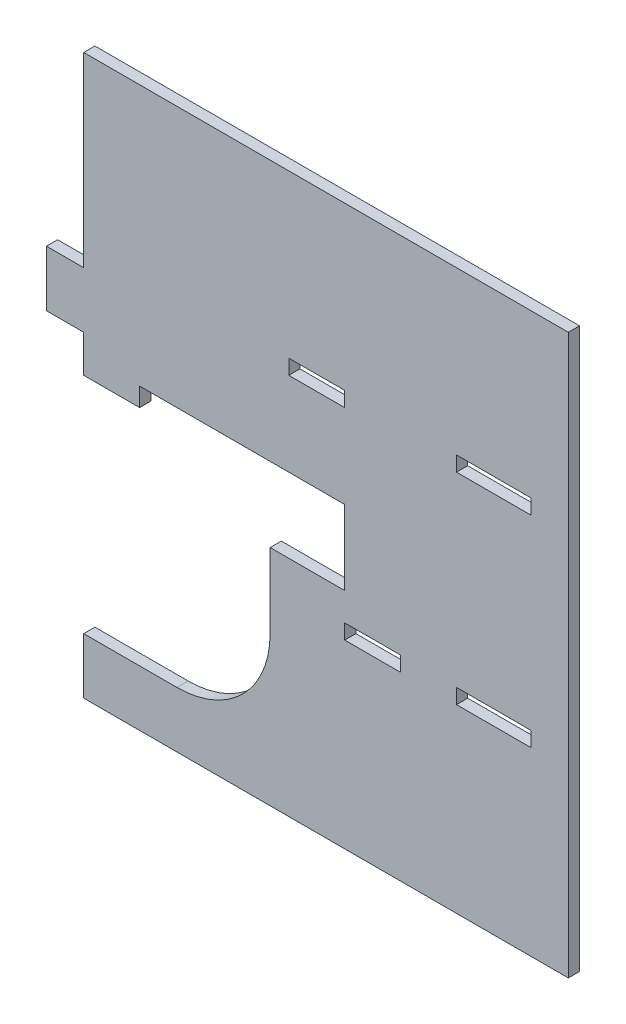
ISO-10303-21;
HEADER;
FILE_DESCRIPTION(('STEP AP214'),'2;1');
FILE_NAME('part.step','',(''),(''),'','','');
FILE_SCHEMA(('AUTOMOTIVE_DESIGN { 1 0 10303 214 1 1 1 1 }'));
ENDSEC;
DATA;
#1=APPLICATION_CONTEXT('core data for automotive mechanical design processes');
#2=APPLICATION_PROTOCOL_DEFINITION('international standard','automotive_design',2000,#1);
#3=PRODUCT_CONTEXT('',#1,'mechanical');
#4=PRODUCT('Part','Part','',(#3));
#5=PRODUCT_RELATED_PRODUCT_CATEGORY('part','',(#4));
#6=PRODUCT_DEFINITION_FORMATION('','',#4);
#7=PRODUCT_DEFINITION_CONTEXT('part definition',#1,'design');
#8=PRODUCT_DEFINITION('design','',#6,#7);
#9=PRODUCT_DEFINITION_SHAPE('','',#8);
#10=(LENGTH_UNIT() NAMED_UNIT(*) SI_UNIT(.MILLI.,.METRE.));
#11=(NAMED_UNIT(*) PLANE_ANGLE_UNIT() SI_UNIT($,.RADIAN.));
#12=(NAMED_UNIT(*) SI_UNIT($,.STERADIAN.) SOLID_ANGLE_UNIT());
#13=UNCERTAINTY_MEASURE_WITH_UNIT(LENGTH_MEASURE(1.E-05),#10,'distance_accuracy_value','');
#14=(GEOMETRIC_REPRESENTATION_CONTEXT(3) GLOBAL_UNCERTAINTY_ASSIGNED_CONTEXT((#13)) GLOBAL_UNIT_ASSIGNED_CONTEXT((#10,
#11,#12)) REPRESENTATION_CONTEXT('',''));
#15=CARTESIAN_POINT('',(0.,0.,0.));
#16=DIRECTION('',(0.,0.,1.));
#17=DIRECTION('',(1.,0.,0.));
#18=AXIS2_PLACEMENT_3D('',#15,#16,#17);
#19=CARTESIAN_POINT('',(3.,0.,0.15));
#20=DIRECTION('',(-1.,0.,0.));
#21=DIRECTION('',(0.,0.,1.));
#22=AXIS2_PLACEMENT_3D('',#19,#20,#21);
#23=PLANE('',#22);
#24=DIRECTION('',(0.,1.,0.));
#25=VECTOR('',#24,1.);
#26=CARTESIAN_POINT('',(3.,0.,-0.15));
#27=LINE('',#26,#25);
#28=CARTESIAN_POINT('',(3.,0.,-0.15));
#29=VERTEX_POINT('',#28);
#30=CARTESIAN_POINT('',(3.,15.,-0.15));
#31=VERTEX_POINT('',#30);
#32=EDGE_CURVE('E404',#29,#31,#27,.T.);
#33=ORIENTED_EDGE('',*,*,#32,.T.);
#34=DIRECTION('',(0.,0.,-1.));
#35=VECTOR('',#34,1.);
#36=CARTESIAN_POINT('',(3.,15.,0.15));
#37=LINE('',#36,#35);
#38=CARTESIAN_POINT('',(3.,15.,0.15));
#39=VERTEX_POINT('',#38);
#40=EDGE_CURVE('E552',#39,#31,#37,.T.);
#41=ORIENTED_EDGE('',*,*,#40,.F.);
#42=DIRECTION('',(0.,1.,0.));
#43=VECTOR('',#42,1.);
#44=CARTESIAN_POINT('',(3.,0.,0.15));
#45=LINE('',#44,#43);
#46=CARTESIAN_POINT('',(3.,0.,0.15));
#47=VERTEX_POINT('',#46);
#48=EDGE_CURVE('E415',#47,#39,#45,.T.);
#49=ORIENTED_EDGE('',*,*,#48,.F.);
#50=DIRECTION('',(0.,0.,-1.));
#51=VECTOR('',#50,1.);
#52=CARTESIAN_POINT('',(3.,0.,0.15));
#53=LINE('',#52,#51);
#54=EDGE_CURVE('E555',#47,#29,#53,.T.);
#55=ORIENTED_EDGE('',*,*,#54,.T.);
#56=EDGE_LOOP('',(#33,#41,#49,#55));
#57=FACE_BOUND('',#56,.T.);
#58=ADVANCED_FACE('F41',(#57),#23,.F.);
#59=CARTESIAN_POINT('',(-10.,15.,0.15));
#60=DIRECTION('',(0.,-1.,0.));
#61=DIRECTION('',(1.,0.,0.));
#62=AXIS2_PLACEMENT_3D('',#59,#60,#61);
#63=PLANE('',#62);
#64=DIRECTION('',(-1.,0.,0.));
#65=VECTOR('',#64,1.);
#66=CARTESIAN_POINT('',(-10.,15.,-0.15));
#67=LINE('',#66,#65);
#68=CARTESIAN_POINT('',(-10.,15.,-0.15));
#69=VERTEX_POINT('',#68);
#70=EDGE_CURVE('E462',#31,#69,#67,.T.);
#71=ORIENTED_EDGE('',*,*,#70,.T.);
#72=DIRECTION('',(0.,0.,-1.));
#73=VECTOR('',#72,1.);
#74=CARTESIAN_POINT('',(-10.,15.,0.15));
#75=LINE('',#74,#73);
#76=CARTESIAN_POINT('',(-10.,15.,0.15));
#77=VERTEX_POINT('',#76);
#78=EDGE_CURVE('E548',#77,#69,#75,.T.);
#79=ORIENTED_EDGE('',*,*,#78,.F.);
#80=DIRECTION('',(-1.,0.,0.));
#81=VECTOR('',#80,1.);
#82=CARTESIAN_POINT('',(3.,15.,0.15));
#83=LINE('',#82,#81);
#84=EDGE_CURVE('E418',#39,#77,#83,.T.);
#85=ORIENTED_EDGE('',*,*,#84,.F.);
#86=ORIENTED_EDGE('',*,*,#40,.T.);
#87=EDGE_LOOP('',(#71,#79,#85,#86));
#88=FACE_BOUND('',#87,.T.);
#89=ADVANCED_FACE('F595',(#88),#63,.F.);
#90=CARTESIAN_POINT('',(-10.,9.99999999999999,0.15));
#91=DIRECTION('',(1.,0.,0.));
#92=DIRECTION('',(0.,0.,-1.));
#93=AXIS2_PLACEMENT_3D('',#90,#91,#92);
#94=PLANE('',#93);
#95=DIRECTION('',(0.,-1.,0.));
#96=VECTOR('',#95,1.);
#97=CARTESIAN_POINT('',(-10.,9.99999999999999,-0.15));
#98=LINE('',#97,#96);
#99=CARTESIAN_POINT('',(-10.,9.99999999999999,-0.15));
#100=VERTEX_POINT('',#99);
#101=EDGE_CURVE('E465',#69,#100,#98,.T.);
#102=ORIENTED_EDGE('',*,*,#101,.T.);
#103=DIRECTION('',(0.,0.,-1.));
#104=VECTOR('',#103,1.);
#105=CARTESIAN_POINT('',(-10.,9.99999999999999,0.15));
#106=LINE('',#105,#104);
#107=CARTESIAN_POINT('',(-10.,9.99999999999999,0.15));
#108=VERTEX_POINT('',#107);
#109=EDGE_CURVE('E544',#108,#100,#106,.T.);
#110=ORIENTED_EDGE('',*,*,#109,.F.);
#111=DIRECTION('',(0.,-1.,0.));
#112=VECTOR('',#111,1.);
#113=CARTESIAN_POINT('',(-10.,9.99999999999999,0.15));
#114=LINE('',#113,#112);
#115=EDGE_CURVE('E421',#77,#108,#114,.T.);
#116=ORIENTED_EDGE('',*,*,#115,.F.);
#117=ORIENTED_EDGE('',*,*,#78,.T.);
#118=EDGE_LOOP('',(#102,#110,#116,#117));
#119=FACE_BOUND('',#118,.T.);
#120=ADVANCED_FACE('F601',(#119),#94,.F.);
#121=CARTESIAN_POINT('',(-11.,10.,0.15));
#122=DIRECTION('',(0.,-1.,0.));
#123=DIRECTION('',(1.,0.,0.));
#124=AXIS2_PLACEMENT_3D('',#121,#122,#123);
#125=PLANE('',#124);
#126=DIRECTION('',(-1.,0.,0.));
#127=VECTOR('',#126,1.);
#128=CARTESIAN_POINT('',(-11.,10.,-0.15));
#129=LINE('',#128,#127);
#130=CARTESIAN_POINT('',(-11.,10.,-0.15));
#131=VERTEX_POINT('',#130);
#132=EDGE_CURVE('E468',#100,#131,#129,.T.);
#133=ORIENTED_EDGE('',*,*,#132,.T.);
#134=DIRECTION('',(0.,0.,-1.));
#135=VECTOR('',#134,1.);
#136=CARTESIAN_POINT('',(-11.,10.,0.15));
#137=LINE('',#136,#135);
#138=CARTESIAN_POINT('',(-11.,10.,0.15));
#139=VERTEX_POINT('',#138);
#140=EDGE_CURVE('E540',#139,#131,#137,.T.);
#141=ORIENTED_EDGE('',*,*,#140,.F.);
#142=DIRECTION('',(-1.,0.,0.));
#143=VECTOR('',#142,1.);
#144=CARTESIAN_POINT('',(-11.,10.,0.15));
#145=LINE('',#144,#143);
#146=EDGE_CURVE('E424',#108,#139,#145,.T.);
#147=ORIENTED_EDGE('',*,*,#146,.F.);
#148=ORIENTED_EDGE('',*,*,#109,.T.);
#149=EDGE_LOOP('',(#133,#141,#147,#148));
#150=FACE_BOUND('',#149,.T.);
#151=ADVANCED_FACE('F605',(#150),#125,.F.);
#152=CARTESIAN_POINT('',(-11.,8.5,0.15));
#153=DIRECTION('',(1.,0.,0.));
#154=DIRECTION('',(0.,0.,-1.));
#155=AXIS2_PLACEMENT_3D('',#152,#153,#154);
#156=PLANE('',#155);
#157=DIRECTION('',(0.,-1.,0.));
#158=VECTOR('',#157,1.);
#159=CARTESIAN_POINT('',(-11.,8.5,-0.15));
#160=LINE('',#159,#158);
#161=CARTESIAN_POINT('',(-11.,8.5,-0.15));
#162=VERTEX_POINT('',#161);
#163=EDGE_CURVE('E471',#131,#162,#160,.T.);
#164=ORIENTED_EDGE('',*,*,#163,.T.);
#165=DIRECTION('',(0.,0.,-1.));
#166=VECTOR('',#165,1.);
#167=CARTESIAN_POINT('',(-11.,8.5,0.15));
#168=LINE('',#167,#166);
#169=CARTESIAN_POINT('',(-11.,8.5,0.15));
#170=VERTEX_POINT('',#169);
#171=EDGE_CURVE('E536',#170,#162,#168,.T.);
#172=ORIENTED_EDGE('',*,*,#171,.F.);
#173=DIRECTION('',(0.,-1.,0.));
#174=VECTOR('',#173,1.);
#175=CARTESIAN_POINT('',(-11.,8.5,0.15));
#176=LINE('',#175,#174);
#177=EDGE_CURVE('E427',#139,#170,#176,.T.);
#178=ORIENTED_EDGE('',*,*,#177,.F.);
#179=ORIENTED_EDGE('',*,*,#140,.T.);
#180=EDGE_LOOP('',(#164,#172,#178,#179));
#181=FACE_BOUND('',#180,.T.);
#182=ADVANCED_FACE('F610',(#181),#156,.F.);
#183=CARTESIAN_POINT('',(-10.,8.5,0.15));
#184=DIRECTION('',(0.,1.,0.));
#185=DIRECTION('',(0.,0.,1.));
#186=AXIS2_PLACEMENT_3D('',#183,#184,#185);
#187=PLANE('',#186);
#188=DIRECTION('',(1.,0.,0.));
#189=VECTOR('',#188,1.);
#190=CARTESIAN_POINT('',(-10.,8.5,-0.15));
#191=LINE('',#190,#189);
#192=CARTESIAN_POINT('',(-10.,8.5,-0.15));
#193=VERTEX_POINT('',#192);
#194=EDGE_CURVE('E474',#162,#193,#191,.T.);
#195=ORIENTED_EDGE('',*,*,#194,.T.);
#196=DIRECTION('',(0.,0.,-1.));
#197=VECTOR('',#196,1.);
#198=CARTESIAN_POINT('',(-10.,8.5,0.15));
#199=LINE('',#198,#197);
#200=CARTESIAN_POINT('',(-10.,8.5,0.15));
#201=VERTEX_POINT('',#200);
#202=EDGE_CURVE('E532',#201,#193,#199,.T.);
#203=ORIENTED_EDGE('',*,*,#202,.F.);
#204=DIRECTION('',(1.,0.,0.));
#205=VECTOR('',#204,1.);
#206=CARTESIAN_POINT('',(-10.,8.5,0.15));
#207=LINE('',#206,#205);
#208=EDGE_CURVE('E430',#170,#201,#207,.T.);
#209=ORIENTED_EDGE('',*,*,#208,.F.);
#210=ORIENTED_EDGE('',*,*,#171,.T.);
#211=EDGE_LOOP('',(#195,#203,#209,#210));
#212=FACE_BOUND('',#211,.T.);
#213=ADVANCED_FACE('F616',(#212),#187,.F.);
#214=CARTESIAN_POINT('',(-10.,7.5,0.15));
#215=DIRECTION('',(1.,0.,0.));
#216=DIRECTION('',(0.,0.,-1.));
#217=AXIS2_PLACEMENT_3D('',#214,#215,#216);
#218=PLANE('',#217);
#219=DIRECTION('',(0.,-1.,0.));
#220=VECTOR('',#219,1.);
#221=CARTESIAN_POINT('',(-10.,7.5,-0.15));
#222=LINE('',#221,#220);
#223=CARTESIAN_POINT('',(-10.,7.5,-0.15));
#224=VERTEX_POINT('',#223);
#225=EDGE_CURVE('E477',#193,#224,#222,.T.);
#226=ORIENTED_EDGE('',*,*,#225,.T.);
#227=DIRECTION('',(0.,0.,-1.));
#228=VECTOR('',#227,1.);
#229=CARTESIAN_POINT('',(-10.,7.5,0.15));
#230=LINE('',#229,#228);
#231=CARTESIAN_POINT('',(-10.,7.5,0.15));
#232=VERTEX_POINT('',#231);
#233=EDGE_CURVE('E528',#232,#224,#230,.T.);
#234=ORIENTED_EDGE('',*,*,#233,.F.);
#235=DIRECTION('',(0.,-1.,0.));
#236=VECTOR('',#235,1.);
#237=CARTESIAN_POINT('',(-10.,7.5,0.15));
#238=LINE('',#237,#236);
#239=EDGE_CURVE('E433',#201,#232,#238,.T.);
#240=ORIENTED_EDGE('',*,*,#239,.F.);
#241=ORIENTED_EDGE('',*,*,#202,.T.);
#242=EDGE_LOOP('',(#226,#234,#240,#241));
#243=FACE_BOUND('',#242,.T.);
#244=ADVANCED_FACE('F620',(#243),#218,.F.);
#245=CARTESIAN_POINT('',(-8.5,7.5,0.15));
#246=DIRECTION('',(0.,1.,0.));
#247=DIRECTION('',(0.,0.,1.));
#248=AXIS2_PLACEMENT_3D('',#245,#246,#247);
#249=PLANE('',#248);
#250=DIRECTION('',(1.,0.,0.));
#251=VECTOR('',#250,1.);
#252=CARTESIAN_POINT('',(-8.5,7.5,-0.15));
#253=LINE('',#252,#251);
#254=CARTESIAN_POINT('',(-8.5,7.5,-0.15));
#255=VERTEX_POINT('',#254);
#256=EDGE_CURVE('E480',#224,#255,#253,.T.);
#257=ORIENTED_EDGE('',*,*,#256,.T.);
#258=DIRECTION('',(0.,0.,-1.));
#259=VECTOR('',#258,1.);
#260=CARTESIAN_POINT('',(-8.5,7.5,0.15));
#261=LINE('',#260,#259);
#262=CARTESIAN_POINT('',(-8.5,7.5,0.15));
#263=VERTEX_POINT('',#262);
#264=EDGE_CURVE('E524',#263,#255,#261,.T.);
#265=ORIENTED_EDGE('',*,*,#264,.F.);
#266=DIRECTION('',(1.,0.,0.));
#267=VECTOR('',#266,1.);
#268=CARTESIAN_POINT('',(-8.5,7.5,0.15));
#269=LINE('',#268,#267);
#270=EDGE_CURVE('E436',#232,#263,#269,.T.);
#271=ORIENTED_EDGE('',*,*,#270,.F.);
#272=ORIENTED_EDGE('',*,*,#233,.T.);
#273=EDGE_LOOP('',(#257,#265,#271,#272));
#274=FACE_BOUND('',#273,.T.);
#275=ADVANCED_FACE('F625',(#274),#249,.F.);
#276=CARTESIAN_POINT('',(-8.5,8.,0.15));
#277=DIRECTION('',(-1.,0.,0.));
#278=DIRECTION('',(0.,0.,1.));
#279=AXIS2_PLACEMENT_3D('',#276,#277,#278);
#280=PLANE('',#279);
#281=DIRECTION('',(0.,1.,0.));
#282=VECTOR('',#281,1.);
#283=CARTESIAN_POINT('',(-8.5,8.,-0.15));
#284=LINE('',#283,#282);
#285=CARTESIAN_POINT('',(-8.5,8.,-0.15));
#286=VERTEX_POINT('',#285);
#287=EDGE_CURVE('E483',#255,#286,#284,.T.);
#288=ORIENTED_EDGE('',*,*,#287,.T.);
#289=DIRECTION('',(0.,0.,-1.));
#290=VECTOR('',#289,1.);
#291=CARTESIAN_POINT('',(-8.5,8.,0.15));
#292=LINE('',#291,#290);
#293=CARTESIAN_POINT('',(-8.5,8.,0.15));
#294=VERTEX_POINT('',#293);
#295=EDGE_CURVE('E520',#294,#286,#292,.T.);
#296=ORIENTED_EDGE('',*,*,#295,.F.);
#297=DIRECTION('',(0.,1.,0.));
#298=VECTOR('',#297,1.);
#299=CARTESIAN_POINT('',(-8.5,8.,0.15));
#300=LINE('',#299,#298);
#301=EDGE_CURVE('E439',#263,#294,#300,.T.);
#302=ORIENTED_EDGE('',*,*,#301,.F.);
#303=ORIENTED_EDGE('',*,*,#264,.T.);
#304=EDGE_LOOP('',(#288,#296,#302,#303));
#305=FACE_BOUND('',#304,.T.);
#306=ADVANCED_FACE('F631',(#305),#280,.F.);
#307=CARTESIAN_POINT('',(-8.5,8.,0.15));
#308=DIRECTION('',(0.,1.,0.));
#309=DIRECTION('',(-1.,0.,0.));
#310=AXIS2_PLACEMENT_3D('',#307,#308,#309);
#311=PLANE('',#310);
#312=DIRECTION('',(1.,0.,0.));
#313=VECTOR('',#312,1.);
#314=CARTESIAN_POINT('',(-8.5,8.,-0.15));
#315=LINE('',#314,#313);
#316=CARTESIAN_POINT('',(-3.,8.,-0.15));
#317=VERTEX_POINT('',#316);
#318=EDGE_CURVE('E486',#286,#317,#315,.T.);
#319=ORIENTED_EDGE('',*,*,#318,.T.);
#320=DIRECTION('',(0.,0.,-1.));
#321=VECTOR('',#320,1.);
#322=CARTESIAN_POINT('',(-3.,8.,0.15));
#323=LINE('',#322,#321);
#324=CARTESIAN_POINT('',(-3.,8.,0.15));
#325=VERTEX_POINT('',#324);
#326=EDGE_CURVE('E517',#325,#317,#323,.T.);
#327=ORIENTED_EDGE('',*,*,#326,.F.);
#328=DIRECTION('',(1.,0.,0.));
#329=VECTOR('',#328,1.);
#330=CARTESIAN_POINT('',(-8.5,8.,0.15));
#331=LINE('',#330,#329);
#332=EDGE_CURVE('E442',#294,#325,#331,.T.);
#333=ORIENTED_EDGE('',*,*,#332,.F.);
#334=ORIENTED_EDGE('',*,*,#295,.T.);
#335=EDGE_LOOP('',(#319,#327,#333,#334));
#336=FACE_BOUND('',#335,.T.);
#337=ADVANCED_FACE('F635',(#336),#311,.F.);
#338=CARTESIAN_POINT('',(-3.,8.,0.15));
#339=DIRECTION('',(1.,0.,0.));
#340=DIRECTION('',(0.,0.,-1.));
#341=AXIS2_PLACEMENT_3D('',#338,#339,#340);
#342=PLANE('',#341);
#343=DIRECTION('',(0.,-1.,0.));
#344=VECTOR('',#343,1.);
#345=CARTESIAN_POINT('',(-3.,8.,-0.15));
#346=LINE('',#345,#344);
#347=CARTESIAN_POINT('',(-3.,6.,-0.15));
#348=VERTEX_POINT('',#347);
#349=EDGE_CURVE('E489',#317,#348,#346,.T.);
#350=ORIENTED_EDGE('',*,*,#349,.T.);
#351=DIRECTION('',(0.,0.,-1.));
#352=VECTOR('',#351,1.);
#353=CARTESIAN_POINT('',(-3.,6.,0.15));
#354=LINE('',#353,#352);
#355=CARTESIAN_POINT('',(-3.,6.,0.15));
#356=VERTEX_POINT('',#355);
#357=EDGE_CURVE('E514',#356,#348,#354,.T.);
#358=ORIENTED_EDGE('',*,*,#357,.F.);
#359=DIRECTION('',(0.,-1.,0.));
#360=VECTOR('',#359,1.);
#361=CARTESIAN_POINT('',(-3.,8.,0.15));
#362=LINE('',#361,#360);
#363=EDGE_CURVE('E445',#325,#356,#362,.T.);
#364=ORIENTED_EDGE('',*,*,#363,.F.);
#365=ORIENTED_EDGE('',*,*,#326,.T.);
#366=EDGE_LOOP('',(#350,#358,#364,#365));
#367=FACE_BOUND('',#366,.T.);
#368=ADVANCED_FACE('F640',(#367),#342,.F.);
#369=CARTESIAN_POINT('',(-5.,6.,0.15));
#370=DIRECTION('',(0.,-1.,0.));
#371=DIRECTION('',(1.,0.,0.));
#372=AXIS2_PLACEMENT_3D('',#369,#370,#371);
#373=PLANE('',#372);
#374=DIRECTION('',(-1.,0.,0.));
#375=VECTOR('',#374,1.);
#376=CARTESIAN_POINT('',(-5.,6.,-0.15));
#377=LINE('',#376,#375);
#378=CARTESIAN_POINT('',(-5.,6.,-0.15));
#379=VERTEX_POINT('',#378);
#380=EDGE_CURVE('E491',#348,#379,#377,.T.);
#381=ORIENTED_EDGE('',*,*,#380,.T.);
#382=DIRECTION('',(0.,0.,-1.));
#383=VECTOR('',#382,1.);
#384=CARTESIAN_POINT('',(-5.,6.,0.15));
#385=LINE('',#384,#383);
#386=CARTESIAN_POINT('',(-5.,6.,0.15));
#387=VERTEX_POINT('',#386);
#388=EDGE_CURVE('E511',#387,#379,#385,.T.);
#389=ORIENTED_EDGE('',*,*,#388,.F.);
#390=DIRECTION('',(-1.,0.,0.));
#391=VECTOR('',#390,1.);
#392=CARTESIAN_POINT('',(-5.,6.,0.15));
#393=LINE('',#392,#391);
#394=EDGE_CURVE('E447',#356,#387,#393,.T.);
#395=ORIENTED_EDGE('',*,*,#394,.F.);
#396=ORIENTED_EDGE('',*,*,#357,.T.);
#397=EDGE_LOOP('',(#381,#389,#395,#396));
#398=FACE_BOUND('',#397,.T.);
#399=ADVANCED_FACE('F643',(#398),#373,.F.);
#400=CARTESIAN_POINT('',(-5.,1.5,0.15));
#401=DIRECTION('',(1.,0.,0.));
#402=DIRECTION('',(0.,0.,-1.));
#403=AXIS2_PLACEMENT_3D('',#400,#401,#402);
#404=PLANE('',#403);
#405=DIRECTION('',(0.,-1.,0.));
#406=VECTOR('',#405,1.);
#407=CARTESIAN_POINT('',(-5.,1.5,-0.15));
#408=LINE('',#407,#406);
#409=CARTESIAN_POINT('',(-5.,4.,-0.15));
#410=VERTEX_POINT('',#409);
#411=EDGE_CURVE('E493',#379,#410,#408,.T.);
#412=ORIENTED_EDGE('',*,*,#411,.T.);
#413=DIRECTION('',(0.,0.,-1.));
#414=VECTOR('',#413,1.);
#415=CARTESIAN_POINT('',(-5.,4.,0.15));
#416=LINE('',#415,#414);
#417=CARTESIAN_POINT('',(-5.,4.,0.15));
#418=VERTEX_POINT('',#417);
#419=EDGE_CURVE('E561',#410,#418,#416,.F.);
#420=ORIENTED_EDGE('',*,*,#419,.T.);
#421=DIRECTION('',(0.,-1.,0.));
#422=VECTOR('',#421,1.);
#423=CARTESIAN_POINT('',(-5.,1.5,0.15));
#424=LINE('',#423,#422);
#425=EDGE_CURVE('E449',#387,#418,#424,.T.);
#426=ORIENTED_EDGE('',*,*,#425,.F.);
#427=ORIENTED_EDGE('',*,*,#388,.T.);
#428=EDGE_LOOP('',(#412,#420,#426,#427));
#429=FACE_BOUND('',#428,.T.);
#430=ADVANCED_FACE('F572',(#429),#404,.F.);
#431=CARTESIAN_POINT('',(-5.,1.5,0.15));
#432=DIRECTION('',(0.,-1.,0.));
#433=DIRECTION('',(1.,0.,0.));
#434=AXIS2_PLACEMENT_3D('',#431,#432,#433);
#435=PLANE('',#434);
#436=DIRECTION('',(-1.,0.,0.));
#437=VECTOR('',#436,1.);
#438=CARTESIAN_POINT('',(-5.,1.5,0.15));
#439=LINE('',#438,#437);
#440=CARTESIAN_POINT('',(-7.5,1.5,0.15));
#441=VERTEX_POINT('',#440);
#442=CARTESIAN_POINT('',(-10.,1.5,0.15));
#443=VERTEX_POINT('',#442);
#444=EDGE_CURVE('E452',#441,#443,#439,.T.);
#445=ORIENTED_EDGE('',*,*,#444,.F.);
#446=DIRECTION('',(0.,0.,-1.));
#447=VECTOR('',#446,1.);
#448=CARTESIAN_POINT('',(-7.5,1.5,-0.15));
#449=LINE('',#448,#447);
#450=CARTESIAN_POINT('',(-7.5,1.5,-0.15));
#451=VERTEX_POINT('',#450);
#452=EDGE_CURVE('E558',#441,#451,#449,.T.);
#453=ORIENTED_EDGE('',*,*,#452,.T.);
#454=DIRECTION('',(-1.,0.,0.));
#455=VECTOR('',#454,1.);
#456=CARTESIAN_POINT('',(-5.,1.5,-0.15));
#457=LINE('',#456,#455);
#458=CARTESIAN_POINT('',(-10.,1.5,-0.15));
#459=VERTEX_POINT('',#458);
#460=EDGE_CURVE('E496',#451,#459,#457,.T.);
#461=ORIENTED_EDGE('',*,*,#460,.T.);
#462=DIRECTION('',(0.,0.,-1.));
#463=VECTOR('',#462,1.);
#464=CARTESIAN_POINT('',(-10.,1.5,0.15));
#465=LINE('',#464,#463);
#466=EDGE_CURVE('E507',#443,#459,#465,.T.);
#467=ORIENTED_EDGE('',*,*,#466,.F.);
#468=EDGE_LOOP('',(#445,#453,#461,#467));
#469=FACE_BOUND('',#468,.T.);
#470=ADVANCED_FACE('F581',(#469),#435,.F.);
#471=CARTESIAN_POINT('',(-10.,1.5,0.15));
#472=DIRECTION('',(1.,0.,0.));
#473=DIRECTION('',(0.,0.,-1.));
#474=AXIS2_PLACEMENT_3D('',#471,#472,#473);
#475=PLANE('',#474);
#476=DIRECTION('',(0.,-1.,0.));
#477=VECTOR('',#476,1.);
#478=CARTESIAN_POINT('',(-10.,1.5,-0.15));
#479=LINE('',#478,#477);
#480=CARTESIAN_POINT('',(-10.,0.,-0.15));
#481=VERTEX_POINT('',#480);
#482=EDGE_CURVE('E499',#459,#481,#479,.T.);
#483=ORIENTED_EDGE('',*,*,#482,.T.);
#484=DIRECTION('',(0.,0.,-1.));
#485=VECTOR('',#484,1.);
#486=CARTESIAN_POINT('',(-10.,0.,0.15));
#487=LINE('',#486,#485);
#488=CARTESIAN_POINT('',(-10.,0.,0.15));
#489=VERTEX_POINT('',#488);
#490=EDGE_CURVE('E459',#489,#481,#487,.T.);
#491=ORIENTED_EDGE('',*,*,#490,.F.);
#492=DIRECTION('',(0.,-1.,0.));
#493=VECTOR('',#492,1.);
#494=CARTESIAN_POINT('',(-10.,1.5,0.15));
#495=LINE('',#494,#493);
#496=EDGE_CURVE('E455',#443,#489,#495,.T.);
#497=ORIENTED_EDGE('',*,*,#496,.F.);
#498=ORIENTED_EDGE('',*,*,#466,.T.);
#499=EDGE_LOOP('',(#483,#491,#497,#498));
#500=FACE_BOUND('',#499,.T.);
#501=ADVANCED_FACE('F585',(#500),#475,.F.);
#502=CARTESIAN_POINT('',(0.,0.,0.15));
#503=DIRECTION('',(0.,1.,0.));
#504=DIRECTION('',(-1.,0.,0.));
#505=AXIS2_PLACEMENT_3D('',#502,#503,#504);
#506=PLANE('',#505);
#507=DIRECTION('',(1.,0.,0.));
#508=VECTOR('',#507,1.);
#509=CARTESIAN_POINT('',(0.,0.,-0.15));
#510=LINE('',#509,#508);
#511=EDGE_CURVE('E416',#481,#29,#510,.T.);
#512=ORIENTED_EDGE('',*,*,#511,.T.);
#513=ORIENTED_EDGE('',*,*,#54,.F.);
#514=DIRECTION('',(1.,0.,0.));
#515=VECTOR('',#514,1.);
#516=CARTESIAN_POINT('',(0.,0.,0.15));
#517=LINE('',#516,#515);
#518=EDGE_CURVE('E411',#489,#47,#517,.T.);
#519=ORIENTED_EDGE('',*,*,#518,.F.);
#520=ORIENTED_EDGE('',*,*,#490,.T.);
#521=EDGE_LOOP('',(#512,#513,#519,#520));
#522=FACE_BOUND('',#521,.T.);
#523=ADVANCED_FACE('F589',(#522),#506,.F.);
#524=CARTESIAN_POINT('',(0.,0.,0.15));
#525=DIRECTION('',(0.,0.,1.));
#526=DIRECTION('',(1.,0.,0.));
#527=AXIS2_PLACEMENT_3D('',#524,#525,#526);
#528=PLANE('',#527);
#529=DIRECTION('',(0.,1.,0.));
#530=VECTOR('',#529,1.);
#531=CARTESIAN_POINT('',(-1.5,5.25,0.15));
#532=LINE('',#531,#530);
#533=CARTESIAN_POINT('',(-1.5,4.85,0.15));
#534=VERTEX_POINT('',#533);
#535=CARTESIAN_POINT('',(-1.5,5.25,0.15));
#536=VERTEX_POINT('',#535);
#537=EDGE_CURVE('E56',#534,#536,#532,.T.);
#538=ORIENTED_EDGE('',*,*,#537,.F.);
#539=DIRECTION('',(1.,0.,0.));
#540=VECTOR('',#539,1.);
#541=CARTESIAN_POINT('',(-1.5,4.85,0.15));
#542=LINE('',#541,#540);
#543=CARTESIAN_POINT('',(-3.,4.85,0.15));
#544=VERTEX_POINT('',#543);
#545=EDGE_CURVE('E322',#544,#534,#542,.T.);
#546=ORIENTED_EDGE('',*,*,#545,.F.);
#547=DIRECTION('',(0.,-1.,0.));
#548=VECTOR('',#547,1.);
#549=CARTESIAN_POINT('',(-3.,5.25,0.15));
#550=LINE('',#549,#548);
#551=CARTESIAN_POINT('',(-3.,5.25,0.15));
#552=VERTEX_POINT('',#551);
#553=EDGE_CURVE('E337',#552,#544,#550,.T.);
#554=ORIENTED_EDGE('',*,*,#553,.F.);
#555=DIRECTION('',(-1.,0.,0.));
#556=VECTOR('',#555,1.);
#557=CARTESIAN_POINT('',(-1.5,5.25,0.15));
#558=LINE('',#557,#556);
#559=EDGE_CURVE('E333',#536,#552,#558,.T.);
#560=ORIENTED_EDGE('',*,*,#559,.F.);
#561=EDGE_LOOP('',(#538,#546,#554,#560));
#562=FACE_BOUND('',#561,.T.);
#563=DIRECTION('',(0.,1.,0.));
#564=VECTOR('',#563,1.);
#565=CARTESIAN_POINT('',(2.,10.65,0.15));
#566=LINE('',#565,#564);
#567=CARTESIAN_POINT('',(2.,10.25,0.15));
#568=VERTEX_POINT('',#567);
#569=CARTESIAN_POINT('',(2.,10.65,0.15));
#570=VERTEX_POINT('',#569);
#571=EDGE_CURVE('E64',#568,#570,#566,.T.);
#572=ORIENTED_EDGE('',*,*,#571,.F.);
#573=DIRECTION('',(1.,0.,0.));
#574=VECTOR('',#573,1.);
#575=CARTESIAN_POINT('',(2.,10.25,0.15));
#576=LINE('',#575,#574);
#577=CARTESIAN_POINT('',(0.,10.25,0.15));
#578=VERTEX_POINT('',#577);
#579=EDGE_CURVE('E354',#578,#568,#576,.T.);
#580=ORIENTED_EDGE('',*,*,#579,.F.);
#581=DIRECTION('',(0.,-1.,0.));
#582=VECTOR('',#581,1.);
#583=CARTESIAN_POINT('',(0.,10.65,0.15));
#584=LINE('',#583,#582);
#585=CARTESIAN_POINT('',(0.,10.65,0.15));
#586=VERTEX_POINT('',#585);
#587=EDGE_CURVE('E368',#586,#578,#584,.T.);
#588=ORIENTED_EDGE('',*,*,#587,.F.);
#589=DIRECTION('',(-1.,0.,0.));
#590=VECTOR('',#589,1.);
#591=CARTESIAN_POINT('',(2.,10.65,0.15));
#592=LINE('',#591,#590);
#593=EDGE_CURVE('E365',#570,#586,#592,.T.);
#594=ORIENTED_EDGE('',*,*,#593,.F.);
#595=EDGE_LOOP('',(#572,#580,#588,#594));
#596=FACE_BOUND('',#595,.T.);
#597=DIRECTION('',(0.,1.,0.));
#598=VECTOR('',#597,1.);
#599=CARTESIAN_POINT('',(-3.,10.65,0.15));
#600=LINE('',#599,#598);
#601=CARTESIAN_POINT('',(-3.,10.25,0.15));
#602=VERTEX_POINT('',#601);
#603=CARTESIAN_POINT('',(-3.,10.65,0.15));
#604=VERTEX_POINT('',#603);
#605=EDGE_CURVE('E282',#602,#604,#600,.T.);
#606=ORIENTED_EDGE('',*,*,#605,.F.);
#607=DIRECTION('',(1.,0.,0.));
#608=VECTOR('',#607,1.);
#609=CARTESIAN_POINT('',(-3.,10.25,0.15));
#610=LINE('',#609,#608);
#611=CARTESIAN_POINT('',(-4.5,10.25,0.15));
#612=VERTEX_POINT('',#611);
#613=EDGE_CURVE('E300',#612,#602,#610,.T.);
#614=ORIENTED_EDGE('',*,*,#613,.F.);
#615=DIRECTION('',(0.,-1.,0.));
#616=VECTOR('',#615,1.);
#617=CARTESIAN_POINT('',(-4.5,10.65,0.15));
#618=LINE('',#617,#616);
#619=CARTESIAN_POINT('',(-4.5,10.65,0.15));
#620=VERTEX_POINT('',#619);
#621=EDGE_CURVE('E303',#620,#612,#618,.T.);
#622=ORIENTED_EDGE('',*,*,#621,.F.);
#623=DIRECTION('',(-1.,0.,0.));
#624=VECTOR('',#623,1.);
#625=CARTESIAN_POINT('',(-3.,10.65,0.15));
#626=LINE('',#625,#624);
#627=EDGE_CURVE('E309',#604,#620,#626,.T.);
#628=ORIENTED_EDGE('',*,*,#627,.F.);
#629=EDGE_LOOP('',(#606,#614,#622,#628));
#630=FACE_BOUND('',#629,.T.);
#631=DIRECTION('',(0.,1.,0.));
#632=VECTOR('',#631,1.);
#633=CARTESIAN_POINT('',(2.,5.25,0.15));
#634=LINE('',#633,#632);
#635=CARTESIAN_POINT('',(2.,4.85,0.15));
#636=VERTEX_POINT('',#635);
#637=CARTESIAN_POINT('',(2.,5.25,0.15));
#638=VERTEX_POINT('',#637);
#639=EDGE_CURVE('E344',#636,#638,#634,.T.);
#640=ORIENTED_EDGE('',*,*,#639,.F.);
#641=DIRECTION('',(1.,0.,0.));
#642=VECTOR('',#641,1.);
#643=CARTESIAN_POINT('',(2.,4.85,0.15));
#644=LINE('',#643,#642);
#645=CARTESIAN_POINT('',(0.,4.85,0.15));
#646=VERTEX_POINT('',#645);
#647=EDGE_CURVE('E383',#646,#636,#644,.T.);
#648=ORIENTED_EDGE('',*,*,#647,.F.);
#649=DIRECTION('',(0.,-1.,0.));
#650=VECTOR('',#649,1.);
#651=CARTESIAN_POINT('',(0.,5.25,0.15));
#652=LINE('',#651,#650);
#653=CARTESIAN_POINT('',(0.,5.25,0.15));
#654=VERTEX_POINT('',#653);
#655=EDGE_CURVE('E397',#654,#646,#652,.T.);
#656=ORIENTED_EDGE('',*,*,#655,.F.);
#657=DIRECTION('',(-1.,0.,0.));
#658=VECTOR('',#657,1.);
#659=CARTESIAN_POINT('',(2.,5.25,0.15));
#660=LINE('',#659,#658);
#661=EDGE_CURVE('E394',#638,#654,#660,.T.);
#662=ORIENTED_EDGE('',*,*,#661,.F.);
#663=EDGE_LOOP('',(#640,#648,#656,#662));
#664=FACE_BOUND('',#663,.T.);
#665=ORIENTED_EDGE('',*,*,#518,.T.);
#666=ORIENTED_EDGE('',*,*,#48,.T.);
#667=ORIENTED_EDGE('',*,*,#84,.T.);
#668=ORIENTED_EDGE('',*,*,#115,.T.);
#669=ORIENTED_EDGE('',*,*,#146,.T.);
#670=ORIENTED_EDGE('',*,*,#177,.T.);
#671=ORIENTED_EDGE('',*,*,#208,.T.);
#672=ORIENTED_EDGE('',*,*,#239,.T.);
#673=ORIENTED_EDGE('',*,*,#270,.T.);
#674=ORIENTED_EDGE('',*,*,#301,.T.);
#675=ORIENTED_EDGE('',*,*,#332,.T.);
#676=ORIENTED_EDGE('',*,*,#363,.T.);
#677=ORIENTED_EDGE('',*,*,#394,.T.);
#678=ORIENTED_EDGE('',*,*,#425,.T.);
#679=CARTESIAN_POINT('',(-7.5,4.,0.15));
#680=DIRECTION('',(0.,0.,1.));
#681=DIRECTION('',(1.,0.,0.));
#682=AXIS2_PLACEMENT_3D('',#679,#680,#681);
#683=CIRCLE('',#682,2.5);
#684=EDGE_CURVE('E11',#418,#441,#683,.F.);
#685=ORIENTED_EDGE('',*,*,#684,.T.);
#686=ORIENTED_EDGE('',*,*,#444,.T.);
#687=ORIENTED_EDGE('',*,*,#496,.T.);
#688=EDGE_LOOP('',(#665,#666,#667,#668,#669,#670,#671,#672,#673,#674,#675,#676,#677,#678,#685,
#686,#687));
#689=FACE_BOUND('',#688,.T.);
#690=ADVANCED_FACE('F578',(#562,#596,#630,#664,#689),#528,.T.);
#691=CARTESIAN_POINT('',(0.,0.,-0.15));
#692=DIRECTION('',(0.,0.,1.));
#693=DIRECTION('',(1.,0.,0.));
#694=AXIS2_PLACEMENT_3D('',#691,#692,#693);
#695=PLANE('',#694);
#696=DIRECTION('',(1.,0.,0.));
#697=VECTOR('',#696,1.);
#698=CARTESIAN_POINT('',(-1.5,4.85,-0.15));
#699=LINE('',#698,#697);
#700=CARTESIAN_POINT('',(-3.,4.85,-0.15));
#701=VERTEX_POINT('',#700);
#702=CARTESIAN_POINT('',(-1.5,4.85,-0.15));
#703=VERTEX_POINT('',#702);
#704=EDGE_CURVE('E328',#701,#703,#699,.T.);
#705=ORIENTED_EDGE('',*,*,#704,.T.);
#706=DIRECTION('',(0.,1.,0.));
#707=VECTOR('',#706,1.);
#708=CARTESIAN_POINT('',(-1.5,5.25,-0.15));
#709=LINE('',#708,#707);
#710=CARTESIAN_POINT('',(-1.5,5.25,-0.15));
#711=VERTEX_POINT('',#710);
#712=EDGE_CURVE('E318',#703,#711,#709,.T.);
#713=ORIENTED_EDGE('',*,*,#712,.T.);
#714=DIRECTION('',(-1.,0.,0.));
#715=VECTOR('',#714,1.);
#716=CARTESIAN_POINT('',(-1.5,5.25,-0.15));
#717=LINE('',#716,#715);
#718=CARTESIAN_POINT('',(-3.,5.25,-0.15));
#719=VERTEX_POINT('',#718);
#720=EDGE_CURVE('E321',#711,#719,#717,.T.);
#721=ORIENTED_EDGE('',*,*,#720,.T.);
#722=DIRECTION('',(0.,-1.,0.));
#723=VECTOR('',#722,1.);
#724=CARTESIAN_POINT('',(-3.,5.25,-0.15));
#725=LINE('',#724,#723);
#726=EDGE_CURVE('E325',#719,#701,#725,.T.);
#727=ORIENTED_EDGE('',*,*,#726,.T.);
#728=EDGE_LOOP('',(#705,#713,#721,#727));
#729=FACE_BOUND('',#728,.T.);
#730=DIRECTION('',(1.,0.,0.));
#731=VECTOR('',#730,1.);
#732=CARTESIAN_POINT('',(2.,10.25,-0.15));
#733=LINE('',#732,#731);
#734=CARTESIAN_POINT('',(0.,10.25,-0.15));
#735=VERTEX_POINT('',#734);
#736=CARTESIAN_POINT('',(2.,10.25,-0.15));
#737=VERTEX_POINT('',#736);
#738=EDGE_CURVE('E360',#735,#737,#733,.T.);
#739=ORIENTED_EDGE('',*,*,#738,.T.);
#740=DIRECTION('',(0.,1.,0.));
#741=VECTOR('',#740,1.);
#742=CARTESIAN_POINT('',(2.,10.65,-0.15));
#743=LINE('',#742,#741);
#744=CARTESIAN_POINT('',(2.,10.65,-0.15));
#745=VERTEX_POINT('',#744);
#746=EDGE_CURVE('E350',#737,#745,#743,.T.);
#747=ORIENTED_EDGE('',*,*,#746,.T.);
#748=DIRECTION('',(-1.,0.,0.));
#749=VECTOR('',#748,1.);
#750=CARTESIAN_POINT('',(2.,10.65,-0.15));
#751=LINE('',#750,#749);
#752=CARTESIAN_POINT('',(0.,10.65,-0.15));
#753=VERTEX_POINT('',#752);
#754=EDGE_CURVE('E353',#745,#753,#751,.T.);
#755=ORIENTED_EDGE('',*,*,#754,.T.);
#756=DIRECTION('',(0.,-1.,0.));
#757=VECTOR('',#756,1.);
#758=CARTESIAN_POINT('',(0.,10.65,-0.15));
#759=LINE('',#758,#757);
#760=EDGE_CURVE('E357',#753,#735,#759,.T.);
#761=ORIENTED_EDGE('',*,*,#760,.T.);
#762=EDGE_LOOP('',(#739,#747,#755,#761));
#763=FACE_BOUND('',#762,.T.);
#764=DIRECTION('',(1.,0.,0.));
#765=VECTOR('',#764,1.);
#766=CARTESIAN_POINT('',(-3.,10.25,-0.15));
#767=LINE('',#766,#765);
#768=CARTESIAN_POINT('',(-4.5,10.25,-0.15));
#769=VERTEX_POINT('',#768);
#770=CARTESIAN_POINT('',(-3.,10.25,-0.15));
#771=VERTEX_POINT('',#770);
#772=EDGE_CURVE('E287',#769,#771,#767,.T.);
#773=ORIENTED_EDGE('',*,*,#772,.T.);
#774=DIRECTION('',(0.,1.,0.));
#775=VECTOR('',#774,1.);
#776=CARTESIAN_POINT('',(-3.,10.65,-0.15));
#777=LINE('',#776,#775);
#778=CARTESIAN_POINT('',(-3.,10.65,-0.15));
#779=VERTEX_POINT('',#778);
#780=EDGE_CURVE('E279',#771,#779,#777,.T.);
#781=ORIENTED_EDGE('',*,*,#780,.T.);
#782=DIRECTION('',(-1.,0.,0.));
#783=VECTOR('',#782,1.);
#784=CARTESIAN_POINT('',(-3.,10.65,-0.15));
#785=LINE('',#784,#783);
#786=CARTESIAN_POINT('',(-4.5,10.65,-0.15));
#787=VERTEX_POINT('',#786);
#788=EDGE_CURVE('E291',#779,#787,#785,.T.);
#789=ORIENTED_EDGE('',*,*,#788,.T.);
#790=DIRECTION('',(0.,-1.,0.));
#791=VECTOR('',#790,1.);
#792=CARTESIAN_POINT('',(-4.5,10.65,-0.15));
#793=LINE('',#792,#791);
#794=EDGE_CURVE('E295',#787,#769,#793,.T.);
#795=ORIENTED_EDGE('',*,*,#794,.T.);
#796=EDGE_LOOP('',(#773,#781,#789,#795));
#797=FACE_BOUND('',#796,.T.);
#798=DIRECTION('',(1.,0.,0.));
#799=VECTOR('',#798,1.);
#800=CARTESIAN_POINT('',(2.,4.85,-0.15));
#801=LINE('',#800,#799);
#802=CARTESIAN_POINT('',(0.,4.85,-0.15));
#803=VERTEX_POINT('',#802);
#804=CARTESIAN_POINT('',(2.,4.85,-0.15));
#805=VERTEX_POINT('',#804);
#806=EDGE_CURVE('E389',#803,#805,#801,.T.);
#807=ORIENTED_EDGE('',*,*,#806,.T.);
#808=DIRECTION('',(0.,1.,0.));
#809=VECTOR('',#808,1.);
#810=CARTESIAN_POINT('',(2.,5.25,-0.15));
#811=LINE('',#810,#809);
#812=CARTESIAN_POINT('',(2.,5.25,-0.15));
#813=VERTEX_POINT('',#812);
#814=EDGE_CURVE('E379',#805,#813,#811,.T.);
#815=ORIENTED_EDGE('',*,*,#814,.T.);
#816=DIRECTION('',(-1.,0.,0.));
#817=VECTOR('',#816,1.);
#818=CARTESIAN_POINT('',(2.,5.25,-0.15));
#819=LINE('',#818,#817);
#820=CARTESIAN_POINT('',(0.,5.25,-0.15));
#821=VERTEX_POINT('',#820);
#822=EDGE_CURVE('E382',#813,#821,#819,.T.);
#823=ORIENTED_EDGE('',*,*,#822,.T.);
#824=DIRECTION('',(0.,-1.,0.));
#825=VECTOR('',#824,1.);
#826=CARTESIAN_POINT('',(0.,5.25,-0.15));
#827=LINE('',#826,#825);
#828=EDGE_CURVE('E386',#821,#803,#827,.T.);
#829=ORIENTED_EDGE('',*,*,#828,.T.);
#830=EDGE_LOOP('',(#807,#815,#823,#829));
#831=FACE_BOUND('',#830,.T.);
#832=ORIENTED_EDGE('',*,*,#32,.F.);
#833=ORIENTED_EDGE('',*,*,#511,.F.);
#834=ORIENTED_EDGE('',*,*,#482,.F.);
#835=ORIENTED_EDGE('',*,*,#460,.F.);
#836=CARTESIAN_POINT('',(-7.5,4.,-0.15));
#837=DIRECTION('',(0.,0.,1.));
#838=DIRECTION('',(1.,0.,0.));
#839=AXIS2_PLACEMENT_3D('',#836,#837,#838);
#840=CIRCLE('',#839,2.5);
#841=EDGE_CURVE('E49',#451,#410,#840,.T.);
#842=ORIENTED_EDGE('',*,*,#841,.T.);
#843=ORIENTED_EDGE('',*,*,#411,.F.);
#844=ORIENTED_EDGE('',*,*,#380,.F.);
#845=ORIENTED_EDGE('',*,*,#349,.F.);
#846=ORIENTED_EDGE('',*,*,#318,.F.);
#847=ORIENTED_EDGE('',*,*,#287,.F.);
#848=ORIENTED_EDGE('',*,*,#256,.F.);
#849=ORIENTED_EDGE('',*,*,#225,.F.);
#850=ORIENTED_EDGE('',*,*,#194,.F.);
#851=ORIENTED_EDGE('',*,*,#163,.F.);
#852=ORIENTED_EDGE('',*,*,#132,.F.);
#853=ORIENTED_EDGE('',*,*,#101,.F.);
#854=ORIENTED_EDGE('',*,*,#70,.F.);
#855=EDGE_LOOP('',(#832,#833,#834,#835,#842,#843,#844,#845,#846,#847,#848,#849,#850,#851,#852,
#853,#854));
#856=FACE_BOUND('',#855,.T.);
#857=ADVANCED_FACE('F297',(#729,#763,#797,#831,#856),#695,.F.);
#858=CARTESIAN_POINT('',(-7.5,4.,0.15));
#859=DIRECTION('',(0.,0.,1.));
#860=DIRECTION('',(1.,0.,0.));
#861=AXIS2_PLACEMENT_3D('',#858,#859,#860);
#862=CYLINDRICAL_SURFACE('',#861,2.5);
#863=ORIENTED_EDGE('',*,*,#684,.F.);
#864=ORIENTED_EDGE('',*,*,#419,.F.);
#865=ORIENTED_EDGE('',*,*,#841,.F.);
#866=ORIENTED_EDGE('',*,*,#452,.F.);
#867=EDGE_LOOP('',(#863,#864,#865,#866));
#868=FACE_BOUND('',#867,.T.);
#869=ADVANCED_FACE('F43',(#868),#862,.F.);
#870=CARTESIAN_POINT('',(2.,5.25,-0.15));
#871=DIRECTION('',(1.,0.,0.));
#872=DIRECTION('',(0.,1.,0.));
#873=AXIS2_PLACEMENT_3D('',#870,#871,#872);
#874=PLANE('',#873);
#875=ORIENTED_EDGE('',*,*,#639,.T.);
#876=DIRECTION('',(0.,0.,1.));
#877=VECTOR('',#876,1.);
#878=CARTESIAN_POINT('',(2.,5.25,-0.15));
#879=LINE('',#878,#877);
#880=EDGE_CURVE('E392',#813,#638,#879,.T.);
#881=ORIENTED_EDGE('',*,*,#880,.F.);
#882=ORIENTED_EDGE('',*,*,#814,.F.);
#883=DIRECTION('',(0.,0.,1.));
#884=VECTOR('',#883,1.);
#885=CARTESIAN_POINT('',(2.,4.85,-0.15));
#886=LINE('',#885,#884);
#887=EDGE_CURVE('E402',#805,#636,#886,.T.);
#888=ORIENTED_EDGE('',*,*,#887,.T.);
#889=EDGE_LOOP('',(#875,#881,#882,#888));
#890=FACE_BOUND('',#889,.T.);
#891=ADVANCED_FACE('F730',(#890),#874,.F.);
#892=CARTESIAN_POINT('',(2.,4.85,-0.15));
#893=DIRECTION('',(0.,-1.,0.));
#894=DIRECTION('',(0.,0.,-1.));
#895=AXIS2_PLACEMENT_3D('',#892,#893,#894);
#896=PLANE('',#895);
#897=ORIENTED_EDGE('',*,*,#647,.T.);
#898=ORIENTED_EDGE('',*,*,#887,.F.);
#899=ORIENTED_EDGE('',*,*,#806,.F.);
#900=DIRECTION('',(0.,0.,1.));
#901=VECTOR('',#900,1.);
#902=CARTESIAN_POINT('',(0.,4.85,-0.15));
#903=LINE('',#902,#901);
#904=EDGE_CURVE('E405',#803,#646,#903,.T.);
#905=ORIENTED_EDGE('',*,*,#904,.T.);
#906=EDGE_LOOP('',(#897,#898,#899,#905));
#907=FACE_BOUND('',#906,.T.);
#908=ADVANCED_FACE('F755',(#907),#896,.F.);
#909=CARTESIAN_POINT('',(0.,5.25,-0.15));
#910=DIRECTION('',(-1.,0.,0.));
#911=DIRECTION('',(0.,-1.,0.));
#912=AXIS2_PLACEMENT_3D('',#909,#910,#911);
#913=PLANE('',#912);
#914=ORIENTED_EDGE('',*,*,#655,.T.);
#915=ORIENTED_EDGE('',*,*,#904,.F.);
#916=ORIENTED_EDGE('',*,*,#828,.F.);
#917=DIRECTION('',(0.,0.,1.));
#918=VECTOR('',#917,1.);
#919=CARTESIAN_POINT('',(0.,5.25,-0.15));
#920=LINE('',#919,#918);
#921=EDGE_CURVE('E407',#821,#654,#920,.T.);
#922=ORIENTED_EDGE('',*,*,#921,.T.);
#923=EDGE_LOOP('',(#914,#915,#916,#922));
#924=FACE_BOUND('',#923,.T.);
#925=ADVANCED_FACE('F765',(#924),#913,.F.);
#926=CARTESIAN_POINT('',(2.,5.25,-0.15));
#927=DIRECTION('',(0.,1.,0.));
#928=DIRECTION('',(0.,0.,1.));
#929=AXIS2_PLACEMENT_3D('',#926,#927,#928);
#930=PLANE('',#929);
#931=ORIENTED_EDGE('',*,*,#661,.T.);
#932=ORIENTED_EDGE('',*,*,#921,.F.);
#933=ORIENTED_EDGE('',*,*,#822,.F.);
#934=ORIENTED_EDGE('',*,*,#880,.T.);
#935=EDGE_LOOP('',(#931,#932,#933,#934));
#936=FACE_BOUND('',#935,.T.);
#937=ADVANCED_FACE('F775',(#936),#930,.F.);
#938=CARTESIAN_POINT('',(-3.,10.65,-0.15));
#939=DIRECTION('',(1.,0.,0.));
#940=DIRECTION('',(0.,0.,-1.));
#941=AXIS2_PLACEMENT_3D('',#938,#939,#940);
#942=PLANE('',#941);
#943=ORIENTED_EDGE('',*,*,#605,.T.);
#944=DIRECTION('',(0.,0.,1.));
#945=VECTOR('',#944,1.);
#946=CARTESIAN_POINT('',(-3.,10.65,-0.15));
#947=LINE('',#946,#945);
#948=EDGE_CURVE('E275',#779,#604,#947,.T.);
#949=ORIENTED_EDGE('',*,*,#948,.F.);
#950=ORIENTED_EDGE('',*,*,#780,.F.);
#951=DIRECTION('',(0.,0.,1.));
#952=VECTOR('',#951,1.);
#953=CARTESIAN_POINT('',(-3.,10.25,-0.15));
#954=LINE('',#953,#952);
#955=EDGE_CURVE('E313',#771,#602,#954,.T.);
#956=ORIENTED_EDGE('',*,*,#955,.T.);
#957=EDGE_LOOP('',(#943,#949,#950,#956));
#958=FACE_BOUND('',#957,.T.);
#959=ADVANCED_FACE('F277',(#958),#942,.F.);
#960=CARTESIAN_POINT('',(-3.,10.25,-0.15));
#961=DIRECTION('',(0.,-1.,0.));
#962=DIRECTION('',(0.,0.,-1.));
#963=AXIS2_PLACEMENT_3D('',#960,#961,#962);
#964=PLANE('',#963);
#965=ORIENTED_EDGE('',*,*,#613,.T.);
#966=ORIENTED_EDGE('',*,*,#955,.F.);
#967=ORIENTED_EDGE('',*,*,#772,.F.);
#968=DIRECTION('',(0.,0.,1.));
#969=VECTOR('',#968,1.);
#970=CARTESIAN_POINT('',(-4.5,10.25,-0.15));
#971=LINE('',#970,#969);
#972=EDGE_CURVE('E315',#769,#612,#971,.T.);
#973=ORIENTED_EDGE('',*,*,#972,.T.);
#974=EDGE_LOOP('',(#965,#966,#967,#973));
#975=FACE_BOUND('',#974,.T.);
#976=ADVANCED_FACE('F794',(#975),#964,.F.);
#977=CARTESIAN_POINT('',(-4.5,10.65,-0.15));
#978=DIRECTION('',(-1.,0.,0.));
#979=DIRECTION('',(0.,0.,1.));
#980=AXIS2_PLACEMENT_3D('',#977,#978,#979);
#981=PLANE('',#980);
#982=ORIENTED_EDGE('',*,*,#621,.T.);
#983=ORIENTED_EDGE('',*,*,#972,.F.);
#984=ORIENTED_EDGE('',*,*,#794,.F.);
#985=DIRECTION('',(0.,0.,1.));
#986=VECTOR('',#985,1.);
#987=CARTESIAN_POINT('',(-4.5,10.65,-0.15));
#988=LINE('',#987,#986);
#989=EDGE_CURVE('E286',#787,#620,#988,.T.);
#990=ORIENTED_EDGE('',*,*,#989,.T.);
#991=EDGE_LOOP('',(#982,#983,#984,#990));
#992=FACE_BOUND('',#991,.T.);
#993=ADVANCED_FACE('F803',(#992),#981,.F.);
#994=CARTESIAN_POINT('',(-3.,10.65,-0.15));
#995=DIRECTION('',(0.,1.,0.));
#996=DIRECTION('',(0.,0.,1.));
#997=AXIS2_PLACEMENT_3D('',#994,#995,#996);
#998=PLANE('',#997);
#999=ORIENTED_EDGE('',*,*,#627,.T.);
#1000=ORIENTED_EDGE('',*,*,#989,.F.);
#1001=ORIENTED_EDGE('',*,*,#788,.F.);
#1002=ORIENTED_EDGE('',*,*,#948,.T.);
#1003=EDGE_LOOP('',(#999,#1000,#1001,#1002));
#1004=FACE_BOUND('',#1003,.T.);
#1005=ADVANCED_FACE('F292',(#1004),#998,.F.);
#1006=CARTESIAN_POINT('',(2.,10.65,-0.15));
#1007=DIRECTION('',(1.,0.,0.));
#1008=DIRECTION('',(0.,1.,0.));
#1009=AXIS2_PLACEMENT_3D('',#1006,#1007,#1008);
#1010=PLANE('',#1009);
#1011=ORIENTED_EDGE('',*,*,#571,.T.);
#1012=DIRECTION('',(0.,0.,1.));
#1013=VECTOR('',#1012,1.);
#1014=CARTESIAN_POINT('',(2.,10.65,-0.15));
#1015=LINE('',#1014,#1013);
#1016=EDGE_CURVE('E363',#745,#570,#1015,.T.);
#1017=ORIENTED_EDGE('',*,*,#1016,.F.);
#1018=ORIENTED_EDGE('',*,*,#746,.F.);
#1019=DIRECTION('',(0.,0.,1.));
#1020=VECTOR('',#1019,1.);
#1021=CARTESIAN_POINT('',(2.,10.25,-0.15));
#1022=LINE('',#1021,#1020);
#1023=EDGE_CURVE('E334',#737,#568,#1022,.T.);
#1024=ORIENTED_EDGE('',*,*,#1023,.T.);
#1025=EDGE_LOOP('',(#1011,#1017,#1018,#1024));
#1026=FACE_BOUND('',#1025,.T.);
#1027=ADVANCED_FACE('F822',(#1026),#1010,.F.);
#1028=CARTESIAN_POINT('',(2.,10.25,-0.15));
#1029=DIRECTION('',(0.,-1.,0.));
#1030=DIRECTION('',(0.,0.,-1.));
#1031=AXIS2_PLACEMENT_3D('',#1028,#1029,#1030);
#1032=PLANE('',#1031);
#1033=ORIENTED_EDGE('',*,*,#579,.T.);
#1034=ORIENTED_EDGE('',*,*,#1023,.F.);
#1035=ORIENTED_EDGE('',*,*,#738,.F.);
#1036=DIRECTION('',(0.,0.,1.));
#1037=VECTOR('',#1036,1.);
#1038=CARTESIAN_POINT('',(0.,10.25,-0.15));
#1039=LINE('',#1038,#1037);
#1040=EDGE_CURVE('E374',#735,#578,#1039,.T.);
#1041=ORIENTED_EDGE('',*,*,#1040,.T.);
#1042=EDGE_LOOP('',(#1033,#1034,#1035,#1041));
#1043=FACE_BOUND('',#1042,.T.);
#1044=ADVANCED_FACE('F831',(#1043),#1032,.F.);
#1045=CARTESIAN_POINT('',(0.,10.65,-0.15));
#1046=DIRECTION('',(-1.,0.,0.));
#1047=DIRECTION('',(0.,-1.,0.));
#1048=AXIS2_PLACEMENT_3D('',#1045,#1046,#1047);
#1049=PLANE('',#1048);
#1050=ORIENTED_EDGE('',*,*,#587,.T.);
#1051=ORIENTED_EDGE('',*,*,#1040,.F.);
#1052=ORIENTED_EDGE('',*,*,#760,.F.);
#1053=DIRECTION('',(0.,0.,1.));
#1054=VECTOR('',#1053,1.);
#1055=CARTESIAN_POINT('',(0.,10.65,-0.15));
#1056=LINE('',#1055,#1054);
#1057=EDGE_CURVE('E376',#753,#586,#1056,.T.);
#1058=ORIENTED_EDGE('',*,*,#1057,.T.);
#1059=EDGE_LOOP('',(#1050,#1051,#1052,#1058));
#1060=FACE_BOUND('',#1059,.T.);
#1061=ADVANCED_FACE('F840',(#1060),#1049,.F.);
#1062=CARTESIAN_POINT('',(2.,10.65,-0.15));
#1063=DIRECTION('',(0.,1.,0.));
#1064=DIRECTION('',(0.,0.,1.));
#1065=AXIS2_PLACEMENT_3D('',#1062,#1063,#1064);
#1066=PLANE('',#1065);
#1067=ORIENTED_EDGE('',*,*,#593,.T.);
#1068=ORIENTED_EDGE('',*,*,#1057,.F.);
#1069=ORIENTED_EDGE('',*,*,#754,.F.);
#1070=ORIENTED_EDGE('',*,*,#1016,.T.);
#1071=EDGE_LOOP('',(#1067,#1068,#1069,#1070));
#1072=FACE_BOUND('',#1071,.T.);
#1073=ADVANCED_FACE('F850',(#1072),#1066,.F.);
#1074=CARTESIAN_POINT('',(-1.5,5.25,-0.15));
#1075=DIRECTION('',(1.,0.,0.));
#1076=DIRECTION('',(0.,0.,-1.));
#1077=AXIS2_PLACEMENT_3D('',#1074,#1075,#1076);
#1078=PLANE('',#1077);
#1079=ORIENTED_EDGE('',*,*,#537,.T.);
#1080=DIRECTION('',(0.,0.,1.));
#1081=VECTOR('',#1080,1.);
#1082=CARTESIAN_POINT('',(-1.5,5.25,-0.15));
#1083=LINE('',#1082,#1081);
#1084=EDGE_CURVE('E331',#711,#536,#1083,.T.);
#1085=ORIENTED_EDGE('',*,*,#1084,.F.);
#1086=ORIENTED_EDGE('',*,*,#712,.F.);
#1087=DIRECTION('',(0.,0.,1.));
#1088=VECTOR('',#1087,1.);
#1089=CARTESIAN_POINT('',(-1.5,4.85,-0.15));
#1090=LINE('',#1089,#1088);
#1091=EDGE_CURVE('E342',#703,#534,#1090,.T.);
#1092=ORIENTED_EDGE('',*,*,#1091,.T.);
#1093=EDGE_LOOP('',(#1079,#1085,#1086,#1092));
#1094=FACE_BOUND('',#1093,.T.);
#1095=ADVANCED_FACE('F860',(#1094),#1078,.F.);
#1096=CARTESIAN_POINT('',(-1.5,4.85,-0.15));
#1097=DIRECTION('',(0.,-1.,0.));
#1098=DIRECTION('',(0.,0.,-1.));
#1099=AXIS2_PLACEMENT_3D('',#1096,#1097,#1098);
#1100=PLANE('',#1099);
#1101=ORIENTED_EDGE('',*,*,#545,.T.);
#1102=ORIENTED_EDGE('',*,*,#1091,.F.);
#1103=ORIENTED_EDGE('',*,*,#704,.F.);
#1104=DIRECTION('',(0.,0.,1.));
#1105=VECTOR('',#1104,1.);
#1106=CARTESIAN_POINT('',(-3.,4.85,-0.15));
#1107=LINE('',#1106,#1105);
#1108=EDGE_CURVE('E345',#701,#544,#1107,.T.);
#1109=ORIENTED_EDGE('',*,*,#1108,.T.);
#1110=EDGE_LOOP('',(#1101,#1102,#1103,#1109));
#1111=FACE_BOUND('',#1110,.T.);
#1112=ADVANCED_FACE('F870',(#1111),#1100,.F.);
#1113=CARTESIAN_POINT('',(-3.,5.25,-0.15));
#1114=DIRECTION('',(-1.,0.,0.));
#1115=DIRECTION('',(0.,0.,1.));
#1116=AXIS2_PLACEMENT_3D('',#1113,#1114,#1115);
#1117=PLANE('',#1116);
#1118=ORIENTED_EDGE('',*,*,#553,.T.);
#1119=ORIENTED_EDGE('',*,*,#1108,.F.);
#1120=ORIENTED_EDGE('',*,*,#726,.F.);
#1121=DIRECTION('',(0.,0.,1.));
#1122=VECTOR('',#1121,1.);
#1123=CARTESIAN_POINT('',(-3.,5.25,-0.15));
#1124=LINE('',#1123,#1122);
#1125=EDGE_CURVE('E347',#719,#552,#1124,.T.);
#1126=ORIENTED_EDGE('',*,*,#1125,.T.);
#1127=EDGE_LOOP('',(#1118,#1119,#1120,#1126));
#1128=FACE_BOUND('',#1127,.T.);
#1129=ADVANCED_FACE('F879',(#1128),#1117,.F.);
#1130=CARTESIAN_POINT('',(-1.5,5.25,-0.15));
#1131=DIRECTION('',(0.,1.,0.));
#1132=DIRECTION('',(0.,0.,1.));
#1133=AXIS2_PLACEMENT_3D('',#1130,#1131,#1132);
#1134=PLANE('',#1133);
#1135=ORIENTED_EDGE('',*,*,#559,.T.);
#1136=ORIENTED_EDGE('',*,*,#1125,.F.);
#1137=ORIENTED_EDGE('',*,*,#720,.F.);
#1138=ORIENTED_EDGE('',*,*,#1084,.T.);
#1139=EDGE_LOOP('',(#1135,#1136,#1137,#1138));
#1140=FACE_BOUND('',#1139,.T.);
#1141=ADVANCED_FACE('F889',(#1140),#1134,.F.);
#1142=CLOSED_SHELL('',(#58,#89,#120,#151,#182,#213,#244,#275,#306,#337,#368,#399,#430,#470,#501,
#523,#690,#857,#869,#891,#908,#925,#937,#959,#976,#993,#1005,#1027,#1044,#1061,#1073,#1095,
#1112,#1129,#1141));
#1143=MANIFOLD_SOLID_BREP('B2',#1142);
#1144=ADVANCED_BREP_SHAPE_REPRESENTATION('',(#18,#1143),#14);
#1145=SHAPE_DEFINITION_REPRESENTATION(#9,#1144);
ENDSEC;
END-ISO-10303-21;
